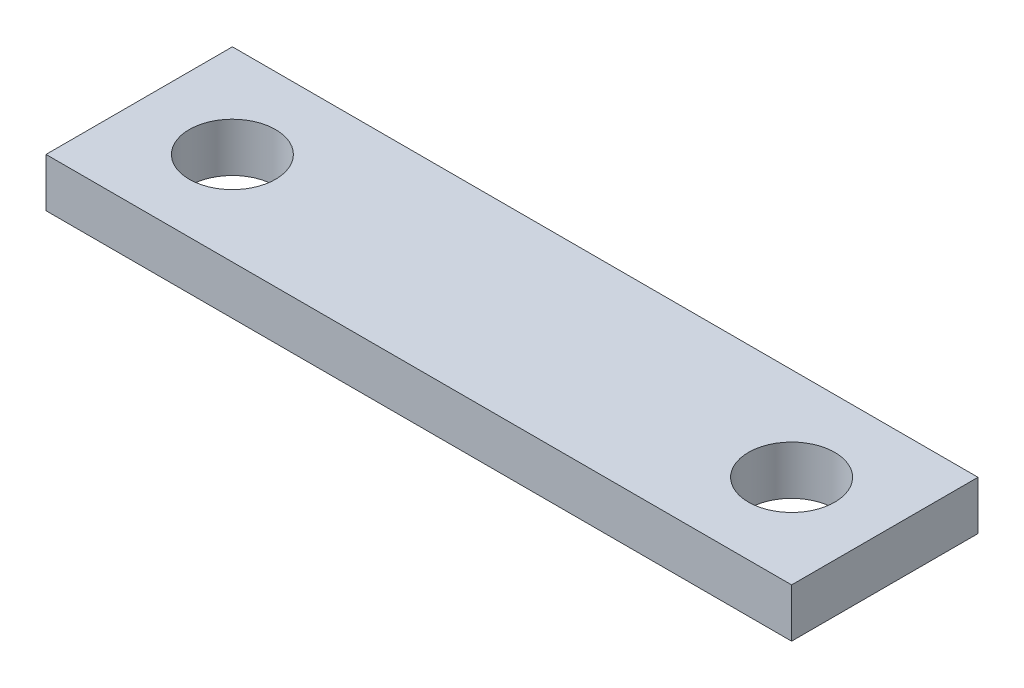
ISO-10303-21;
HEADER;
FILE_DESCRIPTION(('STEP AP214'),'2;1');
FILE_NAME('part.step','',(''),(''),'','','');
FILE_SCHEMA(('AUTOMOTIVE_DESIGN { 1 0 10303 214 1 1 1 1 }'));
ENDSEC;
DATA;
#1=APPLICATION_CONTEXT('core data for automotive mechanical design processes');
#2=APPLICATION_PROTOCOL_DEFINITION('international standard','automotive_design',2000,#1);
#3=PRODUCT_CONTEXT('',#1,'mechanical');
#4=PRODUCT('Part','Part','',(#3));
#5=PRODUCT_RELATED_PRODUCT_CATEGORY('part','',(#4));
#6=PRODUCT_DEFINITION_FORMATION('','',#4);
#7=PRODUCT_DEFINITION_CONTEXT('part definition',#1,'design');
#8=PRODUCT_DEFINITION('design','',#6,#7);
#9=PRODUCT_DEFINITION_SHAPE('','',#8);
#10=(LENGTH_UNIT() NAMED_UNIT(*) SI_UNIT(.MILLI.,.METRE.));
#11=(NAMED_UNIT(*) PLANE_ANGLE_UNIT() SI_UNIT($,.RADIAN.));
#12=(NAMED_UNIT(*) SI_UNIT($,.STERADIAN.) SOLID_ANGLE_UNIT());
#13=UNCERTAINTY_MEASURE_WITH_UNIT(LENGTH_MEASURE(1.E-05),#10,'distance_accuracy_value','');
#14=(GEOMETRIC_REPRESENTATION_CONTEXT(3) GLOBAL_UNCERTAINTY_ASSIGNED_CONTEXT((#13)) GLOBAL_UNIT_ASSIGNED_CONTEXT((#10,
#11,#12)) REPRESENTATION_CONTEXT('',''));
#15=CARTESIAN_POINT('',(0.,0.,0.));
#16=DIRECTION('',(0.,0.,1.));
#17=DIRECTION('',(1.,0.,0.));
#18=AXIS2_PLACEMENT_3D('',#15,#16,#17);
#19=CARTESIAN_POINT('',(0.,1.57,0.));
#20=DIRECTION('',(0.,-1.,0.));
#21=DIRECTION('',(0.,0.,-1.));
#22=AXIS2_PLACEMENT_3D('',#19,#20,#21);
#23=PLANE('',#22);
#24=DIRECTION('',(0.,0.,1.));
#25=VECTOR('',#24,1.);
#26=CARTESIAN_POINT('',(0.,1.57,0.));
#27=LINE('',#26,#25);
#28=CARTESIAN_POINT('',(0.,1.57,-6.));
#29=VERTEX_POINT('',#28);
#30=CARTESIAN_POINT('',(0.,1.57,0.));
#31=VERTEX_POINT('',#30);
#32=EDGE_CURVE('E104',#29,#31,#27,.T.);
#33=ORIENTED_EDGE('',*,*,#32,.T.);
#34=DIRECTION('',(1.,0.,0.));
#35=VECTOR('',#34,1.);
#36=CARTESIAN_POINT('',(0.,1.57,0.));
#37=LINE('',#36,#35);
#38=CARTESIAN_POINT('',(24.,1.57,0.));
#39=VERTEX_POINT('',#38);
#40=EDGE_CURVE('E99',#31,#39,#37,.T.);
#41=ORIENTED_EDGE('',*,*,#40,.T.);
#42=DIRECTION('',(0.,0.,-1.));
#43=VECTOR('',#42,1.);
#44=CARTESIAN_POINT('',(24.,1.57,0.));
#45=LINE('',#44,#43);
#46=CARTESIAN_POINT('',(24.,1.57,-6.));
#47=VERTEX_POINT('',#46);
#48=EDGE_CURVE('E102',#39,#47,#45,.T.);
#49=ORIENTED_EDGE('',*,*,#48,.T.);
#50=DIRECTION('',(-1.,0.,0.));
#51=VECTOR('',#50,1.);
#52=CARTESIAN_POINT('',(0.,1.57,-6.));
#53=LINE('',#52,#51);
#54=EDGE_CURVE('E69',#47,#29,#53,.T.);
#55=ORIENTED_EDGE('',*,*,#54,.T.);
#56=EDGE_LOOP('',(#33,#41,#49,#55));
#57=FACE_BOUND('',#56,.T.);
#58=CARTESIAN_POINT('',(3.,1.57,-3.));
#59=DIRECTION('',(0.,1.,0.));
#60=DIRECTION('',(0.,0.,1.));
#61=AXIS2_PLACEMENT_3D('',#58,#59,#60);
#62=CIRCLE('',#61,1.3890625);
#63=CARTESIAN_POINT('',(3.,1.57,-1.6109375));
#64=VERTEX_POINT('',#63);
#65=EDGE_CURVE('E126',#64,#64,#62,.T.);
#66=ORIENTED_EDGE('',*,*,#65,.F.);
#67=EDGE_LOOP('',(#66));
#68=FACE_BOUND('',#67,.T.);
#69=CARTESIAN_POINT('',(21.,1.57,-3.));
#70=DIRECTION('',(0.,1.,0.));
#71=DIRECTION('',(0.,0.,1.));
#72=AXIS2_PLACEMENT_3D('',#69,#70,#71);
#73=CIRCLE('',#72,1.3890625);
#74=CARTESIAN_POINT('',(21.,1.57,-1.6109375));
#75=VERTEX_POINT('',#74);
#76=EDGE_CURVE('E152',#75,#75,#73,.T.);
#77=ORIENTED_EDGE('',*,*,#76,.F.);
#78=EDGE_LOOP('',(#77));
#79=FACE_BOUND('',#78,.T.);
#80=ADVANCED_FACE('F51',(#57,#68,#79),#23,.F.);
#81=CARTESIAN_POINT('',(0.,0.,0.));
#82=DIRECTION('',(0.,-1.,0.));
#83=DIRECTION('',(0.,0.,-1.));
#84=AXIS2_PLACEMENT_3D('',#81,#82,#83);
#85=PLANE('',#84);
#86=CARTESIAN_POINT('',(3.,0.,-3.));
#87=DIRECTION('',(0.,1.,0.));
#88=DIRECTION('',(0.,0.,1.));
#89=AXIS2_PLACEMENT_3D('',#86,#87,#88);
#90=CIRCLE('',#89,1.3890625);
#91=CARTESIAN_POINT('',(3.,0.,-1.6109375));
#92=VERTEX_POINT('',#91);
#93=EDGE_CURVE('E148',#92,#92,#90,.T.);
#94=ORIENTED_EDGE('',*,*,#93,.T.);
#95=EDGE_LOOP('',(#94));
#96=FACE_BOUND('',#95,.T.);
#97=DIRECTION('',(0.,0.,1.));
#98=VECTOR('',#97,1.);
#99=CARTESIAN_POINT('',(0.,0.,0.));
#100=LINE('',#99,#98);
#101=CARTESIAN_POINT('',(0.,0.,-6.));
#102=VERTEX_POINT('',#101);
#103=CARTESIAN_POINT('',(0.,0.,0.));
#104=VERTEX_POINT('',#103);
#105=EDGE_CURVE('E122',#102,#104,#100,.T.);
#106=ORIENTED_EDGE('',*,*,#105,.F.);
#107=DIRECTION('',(-1.,0.,0.));
#108=VECTOR('',#107,1.);
#109=CARTESIAN_POINT('',(0.,0.,-6.));
#110=LINE('',#109,#108);
#111=CARTESIAN_POINT('',(24.,0.,-6.));
#112=VERTEX_POINT('',#111);
#113=EDGE_CURVE('E92',#112,#102,#110,.T.);
#114=ORIENTED_EDGE('',*,*,#113,.F.);
#115=DIRECTION('',(0.,0.,-1.));
#116=VECTOR('',#115,1.);
#117=CARTESIAN_POINT('',(24.,0.,0.));
#118=LINE('',#117,#116);
#119=CARTESIAN_POINT('',(24.,0.,0.));
#120=VERTEX_POINT('',#119);
#121=EDGE_CURVE('E86',#120,#112,#118,.T.);
#122=ORIENTED_EDGE('',*,*,#121,.F.);
#123=DIRECTION('',(1.,0.,0.));
#124=VECTOR('',#123,1.);
#125=CARTESIAN_POINT('',(0.,0.,0.));
#126=LINE('',#125,#124);
#127=EDGE_CURVE('E109',#104,#120,#126,.T.);
#128=ORIENTED_EDGE('',*,*,#127,.F.);
#129=EDGE_LOOP('',(#106,#114,#122,#128));
#130=FACE_BOUND('',#129,.T.);
#131=CARTESIAN_POINT('',(21.,0.,-3.));
#132=DIRECTION('',(0.,1.,0.));
#133=DIRECTION('',(0.,0.,1.));
#134=AXIS2_PLACEMENT_3D('',#131,#132,#133);
#135=CIRCLE('',#134,1.3890625);
#136=CARTESIAN_POINT('',(21.,0.,-1.6109375));
#137=VERTEX_POINT('',#136);
#138=EDGE_CURVE('E156',#137,#137,#135,.T.);
#139=ORIENTED_EDGE('',*,*,#138,.T.);
#140=EDGE_LOOP('',(#139));
#141=FACE_BOUND('',#140,.T.);
#142=ADVANCED_FACE('F141',(#96,#130,#141),#85,.T.);
#143=CARTESIAN_POINT('',(0.,1.57,0.));
#144=DIRECTION('',(1.,0.,0.));
#145=DIRECTION('',(0.,0.,-1.));
#146=AXIS2_PLACEMENT_3D('',#143,#144,#145);
#147=PLANE('',#146);
#148=ORIENTED_EDGE('',*,*,#105,.T.);
#149=DIRECTION('',(0.,-1.,0.));
#150=VECTOR('',#149,1.);
#151=CARTESIAN_POINT('',(0.,1.57,0.));
#152=LINE('',#151,#150);
#153=EDGE_CURVE('E11',#31,#104,#152,.T.);
#154=ORIENTED_EDGE('',*,*,#153,.F.);
#155=ORIENTED_EDGE('',*,*,#32,.F.);
#156=DIRECTION('',(0.,-1.,0.));
#157=VECTOR('',#156,1.);
#158=CARTESIAN_POINT('',(0.,1.57,-6.));
#159=LINE('',#158,#157);
#160=EDGE_CURVE('E118',#29,#102,#159,.T.);
#161=ORIENTED_EDGE('',*,*,#160,.T.);
#162=EDGE_LOOP('',(#148,#154,#155,#161));
#163=FACE_BOUND('',#162,.T.);
#164=ADVANCED_FACE('F53',(#163),#147,.F.);
#165=CARTESIAN_POINT('',(0.,1.57,0.));
#166=DIRECTION('',(0.,0.,-1.));
#167=DIRECTION('',(-1.,0.,0.));
#168=AXIS2_PLACEMENT_3D('',#165,#166,#167);
#169=PLANE('',#168);
#170=ORIENTED_EDGE('',*,*,#127,.T.);
#171=DIRECTION('',(0.,-1.,0.));
#172=VECTOR('',#171,1.);
#173=CARTESIAN_POINT('',(24.,1.57,0.));
#174=LINE('',#173,#172);
#175=EDGE_CURVE('E61',#39,#120,#174,.T.);
#176=ORIENTED_EDGE('',*,*,#175,.F.);
#177=ORIENTED_EDGE('',*,*,#40,.F.);
#178=ORIENTED_EDGE('',*,*,#153,.T.);
#179=EDGE_LOOP('',(#170,#176,#177,#178));
#180=FACE_BOUND('',#179,.T.);
#181=ADVANCED_FACE('F108',(#180),#169,.F.);
#182=CARTESIAN_POINT('',(24.,1.57,0.));
#183=DIRECTION('',(-1.,0.,0.));
#184=DIRECTION('',(0.,0.,1.));
#185=AXIS2_PLACEMENT_3D('',#182,#183,#184);
#186=PLANE('',#185);
#187=ORIENTED_EDGE('',*,*,#121,.T.);
#188=DIRECTION('',(0.,-1.,0.));
#189=VECTOR('',#188,1.);
#190=CARTESIAN_POINT('',(24.,1.57,-6.));
#191=LINE('',#190,#189);
#192=EDGE_CURVE('E111',#47,#112,#191,.T.);
#193=ORIENTED_EDGE('',*,*,#192,.F.);
#194=ORIENTED_EDGE('',*,*,#48,.F.);
#195=ORIENTED_EDGE('',*,*,#175,.T.);
#196=EDGE_LOOP('',(#187,#193,#194,#195));
#197=FACE_BOUND('',#196,.T.);
#198=ADVANCED_FACE('F112',(#197),#186,.F.);
#199=CARTESIAN_POINT('',(0.,1.57,-6.));
#200=DIRECTION('',(0.,0.,1.));
#201=DIRECTION('',(1.,0.,0.));
#202=AXIS2_PLACEMENT_3D('',#199,#200,#201);
#203=PLANE('',#202);
#204=ORIENTED_EDGE('',*,*,#113,.T.);
#205=ORIENTED_EDGE('',*,*,#160,.F.);
#206=ORIENTED_EDGE('',*,*,#54,.F.);
#207=ORIENTED_EDGE('',*,*,#192,.T.);
#208=EDGE_LOOP('',(#204,#205,#206,#207));
#209=FACE_BOUND('',#208,.T.);
#210=ADVANCED_FACE('F138',(#209),#203,.F.);
#211=CARTESIAN_POINT('',(3.,1.57,-3.));
#212=DIRECTION('',(0.,-1.,0.));
#213=DIRECTION('',(0.,0.,-1.));
#214=AXIS2_PLACEMENT_3D('',#211,#212,#213);
#215=CYLINDRICAL_SURFACE('',#214,1.3890625);
#216=ORIENTED_EDGE('',*,*,#65,.T.);
#217=EDGE_LOOP('',(#216));
#218=FACE_BOUND('',#217,.T.);
#219=ORIENTED_EDGE('',*,*,#93,.F.);
#220=EDGE_LOOP('',(#219));
#221=FACE_BOUND('',#220,.T.);
#222=ADVANCED_FACE('F177',(#218,#221),#215,.F.);
#223=CARTESIAN_POINT('',(21.,1.57,-3.));
#224=DIRECTION('',(0.,-1.,0.));
#225=DIRECTION('',(0.,0.,-1.));
#226=AXIS2_PLACEMENT_3D('',#223,#224,#225);
#227=CYLINDRICAL_SURFACE('',#226,1.3890625);
#228=ORIENTED_EDGE('',*,*,#76,.T.);
#229=EDGE_LOOP('',(#228));
#230=FACE_BOUND('',#229,.T.);
#231=ORIENTED_EDGE('',*,*,#138,.F.);
#232=EDGE_LOOP('',(#231));
#233=FACE_BOUND('',#232,.T.);
#234=ADVANCED_FACE('F166',(#230,#233),#227,.F.);
#235=CLOSED_SHELL('',(#80,#142,#164,#181,#198,#210,#222,#234));
#236=MANIFOLD_SOLID_BREP('B2',#235);
#237=ADVANCED_BREP_SHAPE_REPRESENTATION('',(#18,#236),#14);
#238=SHAPE_DEFINITION_REPRESENTATION(#9,#237);
ENDSEC;
END-ISO-10303-21;
